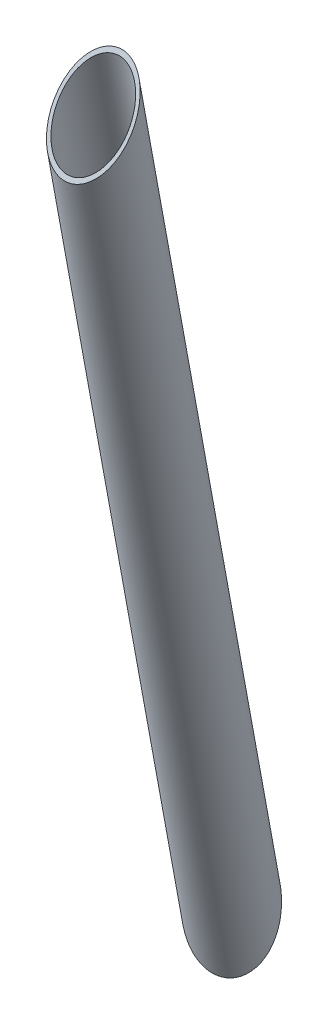
ISO-10303-21;
HEADER;
FILE_DESCRIPTION(('STEP AP214'),'2;1');
FILE_NAME('part.step','',(''),(''),'','','');
FILE_SCHEMA(('AUTOMOTIVE_DESIGN { 1 0 10303 214 1 1 1 1 }'));
ENDSEC;
DATA;
#1=APPLICATION_CONTEXT('core data for automotive mechanical design processes');
#2=APPLICATION_PROTOCOL_DEFINITION('international standard','automotive_design',2000,#1);
#3=PRODUCT_CONTEXT('',#1,'mechanical');
#4=PRODUCT('Part','Part','',(#3));
#5=PRODUCT_RELATED_PRODUCT_CATEGORY('part','',(#4));
#6=PRODUCT_DEFINITION_FORMATION('','',#4);
#7=PRODUCT_DEFINITION_CONTEXT('part definition',#1,'design');
#8=PRODUCT_DEFINITION('design','',#6,#7);
#9=PRODUCT_DEFINITION_SHAPE('','',#8);
#10=(LENGTH_UNIT() NAMED_UNIT(*) SI_UNIT(.MILLI.,.METRE.));
#11=(NAMED_UNIT(*) PLANE_ANGLE_UNIT() SI_UNIT($,.RADIAN.));
#12=(NAMED_UNIT(*) SI_UNIT($,.STERADIAN.) SOLID_ANGLE_UNIT());
#13=UNCERTAINTY_MEASURE_WITH_UNIT(LENGTH_MEASURE(1.E-05),#10,'distance_accuracy_value','');
#14=(GEOMETRIC_REPRESENTATION_CONTEXT(3) GLOBAL_UNCERTAINTY_ASSIGNED_CONTEXT((#13)) GLOBAL_UNIT_ASSIGNED_CONTEXT((#10,
#11,#12)) REPRESENTATION_CONTEXT('',''));
#15=CARTESIAN_POINT('',(0.,0.,0.));
#16=DIRECTION('',(0.,0.,1.));
#17=DIRECTION('',(1.,0.,0.));
#18=AXIS2_PLACEMENT_3D('',#15,#16,#17);
#19=CARTESIAN_POINT('',(325.,320.,-1580.));
#20=DIRECTION('',(-0.214351342090107,-0.914565726251124,-0.342962147344171));
#21=DIRECTION('',(0.,0.351123441588391,-0.936329177569045));
#22=AXIS2_PLACEMENT_3D('',#19,#20,#21);
#23=CYLINDRICAL_SURFACE('',#22,11.3);
#24=CARTESIAN_POINT('',(325.,320.,-1580.));
#25=DIRECTION('',(-0.0100583123703583,0.349879267870479,0.936740801004567));
#26=DIRECTION('',(-0.287052887423583,-0.898369431045867,0.332465043552115));
#27=AXIS2_PLACEMENT_3D('',#24,#25,#26);
#28=ELLIPSE('',#27,17.681163572203,11.3);
#29=CARTESIAN_POINT('',(319.92457094359,304.115783141411,-1574.12163118292));
#30=VERTEX_POINT('',#29);
#31=EDGE_CURVE('E53',#30,#30,#28,.T.);
#32=ORIENTED_EDGE('',*,*,#31,.T.);
#33=EDGE_LOOP('',(#32));
#34=FACE_BOUND('',#33,.T.);
#35=CARTESIAN_POINT('',(245.901636204054,-17.4863521960351,-1706.55738207351));
#36=DIRECTION('',(-0.490298311522755,-0.291983203687916,-0.821190218208958));
#37=DIRECTION('',(0.140336447675245,-0.956366902675742,0.256257739239816));
#38=AXIS2_PLACEMENT_3D('',#35,#36,#37);
#39=ELLIPSE('',#38,17.2843371793662,11.3);
#40=CARTESIAN_POINT('',(248.327258684228,-34.0165202090687,-1702.12813690367));
#41=VERTEX_POINT('',#40);
#42=EDGE_CURVE('E43',#41,#41,#39,.T.);
#43=ORIENTED_EDGE('',*,*,#42,.T.);
#44=EDGE_LOOP('',(#43));
#45=FACE_BOUND('',#44,.T.);
#46=ADVANCED_FACE('F39',(#34,#45),#23,.F.);
#47=CARTESIAN_POINT('',(325.,320.,-1580.));
#48=DIRECTION('',(-0.214351342090107,-0.914565726251124,-0.342962147344171));
#49=DIRECTION('',(0.,0.351123441588391,-0.936329177569045));
#50=AXIS2_PLACEMENT_3D('',#47,#48,#49);
#51=CYLINDRICAL_SURFACE('',#50,12.5);
#52=CARTESIAN_POINT('',(325.,320.,-1580.));
#53=DIRECTION('',(-0.0100583123703583,0.349879267870479,0.936740801004567));
#54=DIRECTION('',(-0.287052887423583,-0.898369431045867,0.332465043552115));
#55=AXIS2_PLACEMENT_3D('',#52,#53,#54);
#56=ELLIPSE('',#55,19.5588092612866,12.5);
#57=CARTESIAN_POINT('',(319.38558732698,302.428963652004,-1573.49737962712));
#58=VERTEX_POINT('',#57);
#59=EDGE_CURVE('E47',#58,#58,#56,.T.);
#60=ORIENTED_EDGE('',*,*,#59,.F.);
#61=EDGE_LOOP('',(#60));
#62=FACE_BOUND('',#61,.T.);
#63=CARTESIAN_POINT('',(245.901636204054,-17.4863521960351,-1706.55738207351));
#64=DIRECTION('',(-0.490298311522755,-0.291983203687916,-0.821190218208958));
#65=DIRECTION('',(0.140336447675245,-0.956366902675742,0.256257739239816));
#66=AXIS2_PLACEMENT_3D('',#63,#64,#65);
#67=ELLIPSE('',#66,19.1198420125733,12.5);
#68=CARTESIAN_POINT('',(248.584846912211,-35.7719362812493,-1701.65777458475));
#69=VERTEX_POINT('',#68);
#70=EDGE_CURVE('E10',#69,#69,#67,.T.);
#71=ORIENTED_EDGE('',*,*,#70,.F.);
#72=EDGE_LOOP('',(#71));
#73=FACE_BOUND('',#72,.T.);
#74=ADVANCED_FACE('F67',(#62,#73),#51,.T.);
#75=CARTESIAN_POINT('',(325.,320.,-1580.));
#76=DIRECTION('',(-0.0100583123703583,0.349879267870479,0.936740801004567));
#77=DIRECTION('',(0.,-0.936788189468734,0.349896967794652));
#78=AXIS2_PLACEMENT_3D('',#75,#76,#77);
#79=PLANE('',#78);
#80=ORIENTED_EDGE('',*,*,#31,.F.);
#81=EDGE_LOOP('',(#80));
#82=FACE_BOUND('',#81,.T.);
#83=ORIENTED_EDGE('',*,*,#59,.T.);
#84=EDGE_LOOP('',(#83));
#85=FACE_BOUND('',#84,.T.);
#86=ADVANCED_FACE('F62',(#82,#85),#79,.T.);
#87=CARTESIAN_POINT('',(254.62354737058,-3.77978778078404,-1716.63838976717));
#88=DIRECTION('',(-0.490298311522755,-0.291983203687916,-0.821190218208958));
#89=DIRECTION('',(-0.858605277115121,0.,0.512637277331708));
#90=AXIS2_PLACEMENT_3D('',#87,#88,#89);
#91=PLANE('',#90);
#92=ORIENTED_EDGE('',*,*,#42,.F.);
#93=EDGE_LOOP('',(#92));
#94=FACE_BOUND('',#93,.T.);
#95=ORIENTED_EDGE('',*,*,#70,.T.);
#96=EDGE_LOOP('',(#95));
#97=FACE_BOUND('',#96,.T.);
#98=ADVANCED_FACE('F41',(#94,#97),#91,.T.);
#99=CLOSED_SHELL('',(#46,#74,#86,#98));
#100=MANIFOLD_SOLID_BREP('B2',#99);
#101=ADVANCED_BREP_SHAPE_REPRESENTATION('',(#18,#100),#14);
#102=SHAPE_DEFINITION_REPRESENTATION(#9,#101);
ENDSEC;
END-ISO-10303-21;
